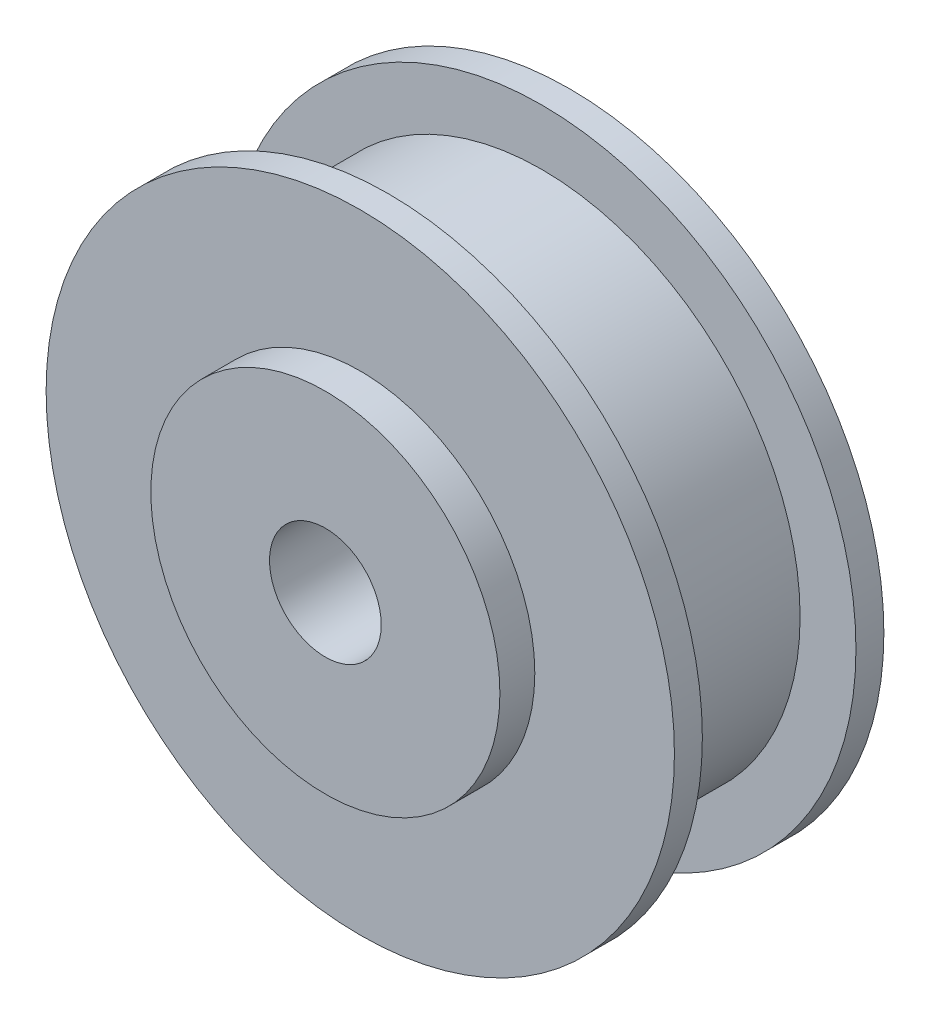
ISO-10303-21;
HEADER;
FILE_DESCRIPTION(('STEP AP214'),'2;1');
FILE_NAME('part.step','',(''),(''),'','','');
FILE_SCHEMA(('AUTOMOTIVE_DESIGN { 1 0 10303 214 1 1 1 1 }'));
ENDSEC;
DATA;
#1=APPLICATION_CONTEXT('core data for automotive mechanical design processes');
#2=APPLICATION_PROTOCOL_DEFINITION('international standard','automotive_design',2000,#1);
#3=PRODUCT_CONTEXT('',#1,'mechanical');
#4=PRODUCT('Part','Part','',(#3));
#5=PRODUCT_RELATED_PRODUCT_CATEGORY('part','',(#4));
#6=PRODUCT_DEFINITION_FORMATION('','',#4);
#7=PRODUCT_DEFINITION_CONTEXT('part definition',#1,'design');
#8=PRODUCT_DEFINITION('design','',#6,#7);
#9=PRODUCT_DEFINITION_SHAPE('','',#8);
#10=(LENGTH_UNIT() NAMED_UNIT(*) SI_UNIT(.MILLI.,.METRE.));
#11=(NAMED_UNIT(*) PLANE_ANGLE_UNIT() SI_UNIT($,.RADIAN.));
#12=(NAMED_UNIT(*) SI_UNIT($,.STERADIAN.) SOLID_ANGLE_UNIT());
#13=UNCERTAINTY_MEASURE_WITH_UNIT(LENGTH_MEASURE(1.E-05),#10,'distance_accuracy_value','');
#14=(GEOMETRIC_REPRESENTATION_CONTEXT(3) GLOBAL_UNCERTAINTY_ASSIGNED_CONTEXT((#13)) GLOBAL_UNIT_ASSIGNED_CONTEXT((#10,
#11,#12)) REPRESENTATION_CONTEXT('',''));
#15=CARTESIAN_POINT('',(0.,0.,0.));
#16=DIRECTION('',(0.,0.,1.));
#17=DIRECTION('',(1.,0.,0.));
#18=AXIS2_PLACEMENT_3D('',#15,#16,#17);
#19=CARTESIAN_POINT('',(0.,0.,15.));
#20=DIRECTION('',(0.,0.,-1.));
#21=DIRECTION('',(-1.,0.,0.));
#22=AXIS2_PLACEMENT_3D('',#19,#20,#21);
#23=CYLINDRICAL_SURFACE('',#22,22.5);
#24=CARTESIAN_POINT('',(0.,0.,15.));
#25=DIRECTION('',(0.,0.,1.));
#26=DIRECTION('',(1.,0.,0.));
#27=AXIS2_PLACEMENT_3D('',#24,#25,#26);
#28=CIRCLE('',#27,22.5);
#29=CARTESIAN_POINT('',(22.5,0.,15.));
#30=VERTEX_POINT('',#29);
#31=EDGE_CURVE('E10',#30,#30,#28,.T.);
#32=ORIENTED_EDGE('',*,*,#31,.F.);
#33=EDGE_LOOP('',(#32));
#34=FACE_BOUND('',#33,.T.);
#35=CARTESIAN_POINT('',(0.,0.,13.));
#36=DIRECTION('',(0.,0.,-1.));
#37=DIRECTION('',(-1.,0.,0.));
#38=AXIS2_PLACEMENT_3D('',#35,#36,#37);
#39=CIRCLE('',#38,22.5);
#40=CARTESIAN_POINT('',(-22.5,0.,13.));
#41=VERTEX_POINT('',#40);
#42=EDGE_CURVE('E56',#41,#41,#39,.T.);
#43=ORIENTED_EDGE('',*,*,#42,.F.);
#44=EDGE_LOOP('',(#43));
#45=FACE_BOUND('',#44,.T.);
#46=ADVANCED_FACE('F30',(#34,#45),#23,.T.);
#47=CARTESIAN_POINT('',(0.,0.,0.));
#48=DIRECTION('',(0.,0.,1.));
#49=DIRECTION('',(1.,0.,0.));
#50=AXIS2_PLACEMENT_3D('',#47,#48,#49);
#51=CIRCLE('',#50,22.5);
#52=CARTESIAN_POINT('',(22.5,0.,0.));
#53=VERTEX_POINT('',#52);
#54=EDGE_CURVE('E33',#53,#53,#51,.T.);
#55=ORIENTED_EDGE('',*,*,#54,.T.);
#56=EDGE_LOOP('',(#55));
#57=FACE_BOUND('',#56,.T.);
#58=CARTESIAN_POINT('',(0.,0.,2.));
#59=DIRECTION('',(0.,0.,-1.));
#60=DIRECTION('',(-1.,0.,0.));
#61=AXIS2_PLACEMENT_3D('',#58,#59,#60);
#62=CIRCLE('',#61,22.5);
#63=CARTESIAN_POINT('',(-22.5,0.,2.));
#64=VERTEX_POINT('',#63);
#65=EDGE_CURVE('E59',#64,#64,#62,.T.);
#66=ORIENTED_EDGE('',*,*,#65,.T.);
#67=EDGE_LOOP('',(#66));
#68=FACE_BOUND('',#67,.T.);
#69=ADVANCED_FACE('F85',(#57,#68),#23,.T.);
#70=CARTESIAN_POINT('',(0.,0.,15.));
#71=DIRECTION('',(0.,0.,1.));
#72=DIRECTION('',(1.,0.,0.));
#73=AXIS2_PLACEMENT_3D('',#70,#71,#72);
#74=PLANE('',#73);
#75=ORIENTED_EDGE('',*,*,#31,.T.);
#76=EDGE_LOOP('',(#75));
#77=FACE_BOUND('',#76,.T.);
#78=CARTESIAN_POINT('',(0.,0.,15.));
#79=DIRECTION('',(0.,0.,1.));
#80=DIRECTION('',(1.,0.,0.));
#81=AXIS2_PLACEMENT_3D('',#78,#79,#80);
#82=CIRCLE('',#81,12.5);
#83=CARTESIAN_POINT('',(12.5,0.,15.));
#84=VERTEX_POINT('',#83);
#85=EDGE_CURVE('E42',#84,#84,#82,.T.);
#86=ORIENTED_EDGE('',*,*,#85,.F.);
#87=EDGE_LOOP('',(#86));
#88=FACE_BOUND('',#87,.T.);
#89=ADVANCED_FACE('F90',(#77,#88),#74,.T.);
#90=CARTESIAN_POINT('',(0.,0.,0.));
#91=DIRECTION('',(0.,0.,1.));
#92=DIRECTION('',(1.,0.,0.));
#93=AXIS2_PLACEMENT_3D('',#90,#91,#92);
#94=PLANE('',#93);
#95=CARTESIAN_POINT('',(0.,0.,0.));
#96=DIRECTION('',(0.,0.,1.));
#97=DIRECTION('',(1.,0.,0.));
#98=AXIS2_PLACEMENT_3D('',#95,#96,#97);
#99=CIRCLE('',#98,4.);
#100=CARTESIAN_POINT('',(4.,0.,0.));
#101=VERTEX_POINT('',#100);
#102=EDGE_CURVE('E45',#101,#101,#99,.T.);
#103=ORIENTED_EDGE('',*,*,#102,.T.);
#104=EDGE_LOOP('',(#103));
#105=FACE_BOUND('',#104,.T.);
#106=ORIENTED_EDGE('',*,*,#54,.F.);
#107=EDGE_LOOP('',(#106));
#108=FACE_BOUND('',#107,.T.);
#109=ADVANCED_FACE('F99',(#105,#108),#94,.F.);
#110=CARTESIAN_POINT('',(0.,0.,17.5));
#111=DIRECTION('',(0.,0.,-1.));
#112=DIRECTION('',(-1.,0.,0.));
#113=AXIS2_PLACEMENT_3D('',#110,#111,#112);
#114=CYLINDRICAL_SURFACE('',#113,12.5);
#115=CARTESIAN_POINT('',(0.,0.,17.5));
#116=DIRECTION('',(0.,0.,1.));
#117=DIRECTION('',(1.,0.,0.));
#118=AXIS2_PLACEMENT_3D('',#115,#116,#117);
#119=CIRCLE('',#118,12.5);
#120=CARTESIAN_POINT('',(12.5,0.,17.5));
#121=VERTEX_POINT('',#120);
#122=EDGE_CURVE('E40',#121,#121,#119,.T.);
#123=ORIENTED_EDGE('',*,*,#122,.F.);
#124=EDGE_LOOP('',(#123));
#125=FACE_BOUND('',#124,.T.);
#126=ORIENTED_EDGE('',*,*,#85,.T.);
#127=EDGE_LOOP('',(#126));
#128=FACE_BOUND('',#127,.T.);
#129=ADVANCED_FACE('F139',(#125,#128),#114,.T.);
#130=CARTESIAN_POINT('',(0.,0.,17.5));
#131=DIRECTION('',(0.,0.,1.));
#132=DIRECTION('',(1.,0.,0.));
#133=AXIS2_PLACEMENT_3D('',#130,#131,#132);
#134=PLANE('',#133);
#135=CARTESIAN_POINT('',(0.,0.,17.5));
#136=DIRECTION('',(0.,0.,1.));
#137=DIRECTION('',(1.,0.,0.));
#138=AXIS2_PLACEMENT_3D('',#135,#136,#137);
#139=CIRCLE('',#138,4.);
#140=CARTESIAN_POINT('',(4.,0.,17.5));
#141=VERTEX_POINT('',#140);
#142=EDGE_CURVE('E50',#141,#141,#139,.T.);
#143=ORIENTED_EDGE('',*,*,#142,.F.);
#144=EDGE_LOOP('',(#143));
#145=FACE_BOUND('',#144,.T.);
#146=ORIENTED_EDGE('',*,*,#122,.T.);
#147=EDGE_LOOP('',(#146));
#148=FACE_BOUND('',#147,.T.);
#149=ADVANCED_FACE('F81',(#145,#148),#134,.T.);
#150=CARTESIAN_POINT('',(0.,0.,-27.5));
#151=DIRECTION('',(0.,0.,1.));
#152=DIRECTION('',(1.,0.,0.));
#153=AXIS2_PLACEMENT_3D('',#150,#151,#152);
#154=CYLINDRICAL_SURFACE('',#153,4.);
#155=ORIENTED_EDGE('',*,*,#142,.T.);
#156=EDGE_LOOP('',(#155));
#157=FACE_BOUND('',#156,.T.);
#158=ORIENTED_EDGE('',*,*,#102,.F.);
#159=EDGE_LOOP('',(#158));
#160=FACE_BOUND('',#159,.T.);
#161=ADVANCED_FACE('F72',(#157,#160),#154,.F.);
#162=CARTESIAN_POINT('',(0.,0.,0.));
#163=DIRECTION('',(0.,0.,-1.));
#164=DIRECTION('',(-1.,0.,0.));
#165=AXIS2_PLACEMENT_3D('',#162,#163,#164);
#166=CYLINDRICAL_SURFACE('',#165,18.5);
#167=CARTESIAN_POINT('',(0.,0.,13.));
#168=DIRECTION('',(0.,0.,-1.));
#169=DIRECTION('',(-1.,0.,0.));
#170=AXIS2_PLACEMENT_3D('',#167,#168,#169);
#171=CIRCLE('',#170,18.5);
#172=CARTESIAN_POINT('',(-18.5,0.,13.));
#173=VERTEX_POINT('',#172);
#174=EDGE_CURVE('E53',#173,#173,#171,.T.);
#175=ORIENTED_EDGE('',*,*,#174,.T.);
#176=EDGE_LOOP('',(#175));
#177=FACE_BOUND('',#176,.T.);
#178=CARTESIAN_POINT('',(0.,0.,2.));
#179=DIRECTION('',(0.,0.,-1.));
#180=DIRECTION('',(-1.,0.,0.));
#181=AXIS2_PLACEMENT_3D('',#178,#179,#180);
#182=CIRCLE('',#181,18.5);
#183=CARTESIAN_POINT('',(-18.5,0.,2.));
#184=VERTEX_POINT('',#183);
#185=EDGE_CURVE('E62',#184,#184,#182,.T.);
#186=ORIENTED_EDGE('',*,*,#185,.F.);
#187=EDGE_LOOP('',(#186));
#188=FACE_BOUND('',#187,.T.);
#189=ADVANCED_FACE('F69',(#177,#188),#166,.T.);
#190=CARTESIAN_POINT('',(18.5,0.,13.));
#191=DIRECTION('',(0.,0.,-1.));
#192=DIRECTION('',(-1.,0.,0.));
#193=AXIS2_PLACEMENT_3D('',#190,#191,#192);
#194=PLANE('',#193);
#195=ORIENTED_EDGE('',*,*,#42,.T.);
#196=EDGE_LOOP('',(#195));
#197=FACE_BOUND('',#196,.T.);
#198=ORIENTED_EDGE('',*,*,#174,.F.);
#199=EDGE_LOOP('',(#198));
#200=FACE_BOUND('',#199,.T.);
#201=ADVANCED_FACE('F71',(#197,#200),#194,.T.);
#202=CARTESIAN_POINT('',(18.5,0.,2.));
#203=DIRECTION('',(0.,0.,1.));
#204=DIRECTION('',(1.,0.,0.));
#205=AXIS2_PLACEMENT_3D('',#202,#203,#204);
#206=PLANE('',#205);
#207=ORIENTED_EDGE('',*,*,#185,.T.);
#208=EDGE_LOOP('',(#207));
#209=FACE_BOUND('',#208,.T.);
#210=ORIENTED_EDGE('',*,*,#65,.F.);
#211=EDGE_LOOP('',(#210));
#212=FACE_BOUND('',#211,.T.);
#213=ADVANCED_FACE('F66',(#209,#212),#206,.T.);
#214=CLOSED_SHELL('',(#46,#69,#89,#109,#129,#149,#161,#189,#201,#213));
#215=MANIFOLD_SOLID_BREP('B2',#214);
#216=ADVANCED_BREP_SHAPE_REPRESENTATION('',(#18,#215),#14);
#217=SHAPE_DEFINITION_REPRESENTATION(#9,#216);
ENDSEC;
END-ISO-10303-21;
